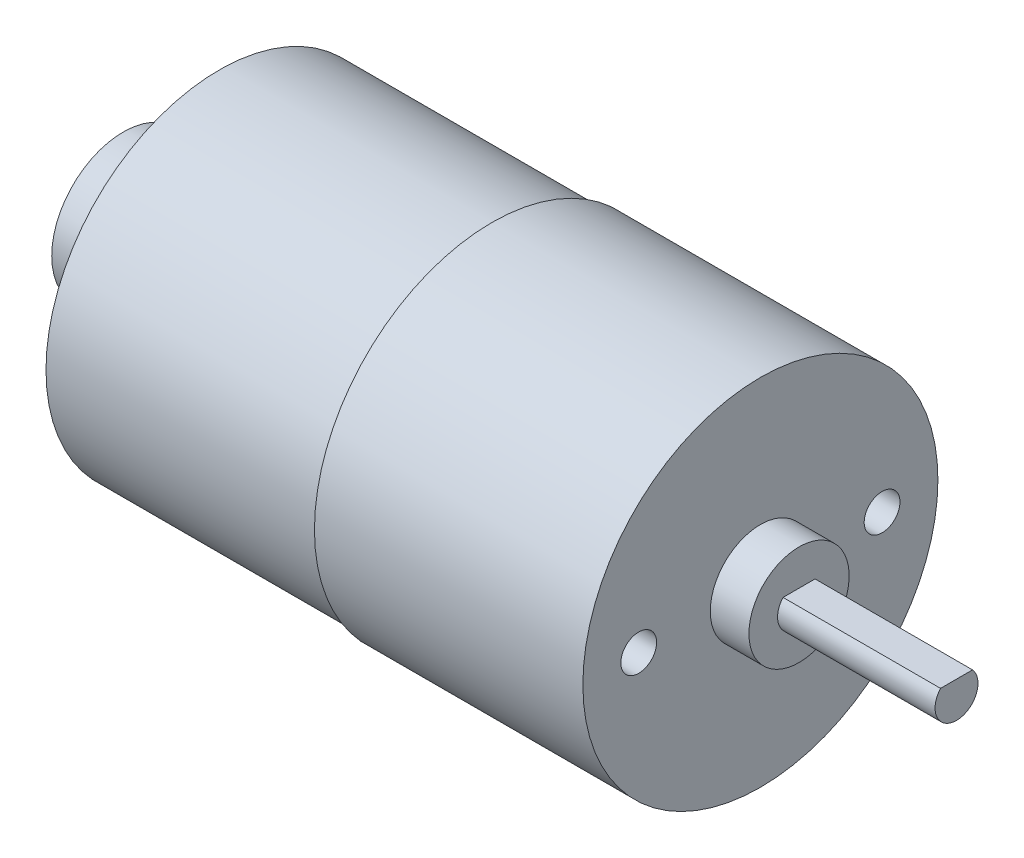
ISO-10303-21;
HEADER;
FILE_DESCRIPTION(('STEP AP214'),'2;1');
FILE_NAME('part.step','',(''),(''),'','','');
FILE_SCHEMA(('AUTOMOTIVE_DESIGN { 1 0 10303 214 1 1 1 1 }'));
ENDSEC;
DATA;
#1=APPLICATION_CONTEXT('core data for automotive mechanical design processes');
#2=APPLICATION_PROTOCOL_DEFINITION('international standard','automotive_design',2000,#1);
#3=PRODUCT_CONTEXT('',#1,'mechanical');
#4=PRODUCT('Part','Part','',(#3));
#5=PRODUCT_RELATED_PRODUCT_CATEGORY('part','',(#4));
#6=PRODUCT_DEFINITION_FORMATION('','',#4);
#7=PRODUCT_DEFINITION_CONTEXT('part definition',#1,'design');
#8=PRODUCT_DEFINITION('design','',#6,#7);
#9=PRODUCT_DEFINITION_SHAPE('','',#8);
#10=(LENGTH_UNIT() NAMED_UNIT(*) SI_UNIT(.MILLI.,.METRE.));
#11=(NAMED_UNIT(*) PLANE_ANGLE_UNIT() SI_UNIT($,.RADIAN.));
#12=(NAMED_UNIT(*) SI_UNIT($,.STERADIAN.) SOLID_ANGLE_UNIT());
#13=UNCERTAINTY_MEASURE_WITH_UNIT(LENGTH_MEASURE(1.E-05),#10,'distance_accuracy_value','');
#14=(GEOMETRIC_REPRESENTATION_CONTEXT(3) GLOBAL_UNCERTAINTY_ASSIGNED_CONTEXT((#13)) GLOBAL_UNIT_ASSIGNED_CONTEXT((#10,
#11,#12)) REPRESENTATION_CONTEXT('',''));
#15=CARTESIAN_POINT('',(0.,0.,0.));
#16=DIRECTION('',(0.,0.,1.));
#17=DIRECTION('',(1.,0.,0.));
#18=AXIS2_PLACEMENT_3D('',#15,#16,#17);
#19=CARTESIAN_POINT('',(37.8,12.4,0.));
#20=DIRECTION('',(-1.,0.,0.));
#21=DIRECTION('',(0.,0.,1.));
#22=AXIS2_PLACEMENT_3D('',#19,#20,#21);
#23=PLANE('',#22);
#24=CARTESIAN_POINT('',(37.8,0.,-8.5));
#25=DIRECTION('',(1.,0.,0.));
#26=DIRECTION('',(0.,0.,-1.));
#27=AXIS2_PLACEMENT_3D('',#24,#25,#26);
#28=CIRCLE('',#27,1.24999999999999);
#29=CARTESIAN_POINT('',(37.8,0.,-9.74999999999999));
#30=VERTEX_POINT('',#29);
#31=EDGE_CURVE('E82',#30,#30,#28,.T.);
#32=ORIENTED_EDGE('',*,*,#31,.F.);
#33=EDGE_LOOP('',(#32));
#34=FACE_BOUND('',#33,.T.);
#35=CARTESIAN_POINT('',(37.8,0.,0.));
#36=DIRECTION('',(-1.,0.,0.));
#37=DIRECTION('',(0.,0.,1.));
#38=AXIS2_PLACEMENT_3D('',#35,#36,#37);
#39=CIRCLE('',#38,12.4);
#40=CARTESIAN_POINT('',(37.8,0.,12.4));
#41=VERTEX_POINT('',#40);
#42=EDGE_CURVE('E98',#41,#41,#39,.T.);
#43=ORIENTED_EDGE('',*,*,#42,.F.);
#44=EDGE_LOOP('',(#43));
#45=FACE_BOUND('',#44,.T.);
#46=CARTESIAN_POINT('',(37.8,0.,0.));
#47=DIRECTION('',(-1.,0.,0.));
#48=DIRECTION('',(0.,0.,1.));
#49=AXIS2_PLACEMENT_3D('',#46,#47,#48);
#50=CIRCLE('',#49,3.5);
#51=CARTESIAN_POINT('',(37.8,0.,3.5));
#52=VERTEX_POINT('',#51);
#53=EDGE_CURVE('E95',#52,#52,#50,.T.);
#54=ORIENTED_EDGE('',*,*,#53,.T.);
#55=EDGE_LOOP('',(#54));
#56=FACE_BOUND('',#55,.T.);
#57=CARTESIAN_POINT('',(37.8,0.,8.5));
#58=DIRECTION('',(1.,0.,0.));
#59=DIRECTION('',(0.,0.,-1.));
#60=AXIS2_PLACEMENT_3D('',#57,#58,#59);
#61=CIRCLE('',#60,1.24999999999999);
#62=CARTESIAN_POINT('',(37.8,0.,7.25000000000001));
#63=VERTEX_POINT('',#62);
#64=EDGE_CURVE('E150',#63,#63,#61,.T.);
#65=ORIENTED_EDGE('',*,*,#64,.F.);
#66=EDGE_LOOP('',(#65));
#67=FACE_BOUND('',#66,.T.);
#68=ADVANCED_FACE('F43',(#34,#45,#56,#67),#23,.F.);
#69=CARTESIAN_POINT('',(0.,0.,0.));
#70=DIRECTION('',(1.,0.,0.));
#71=DIRECTION('',(0.,0.,-1.));
#72=AXIS2_PLACEMENT_3D('',#69,#70,#71);
#73=PLANE('',#72);
#74=CARTESIAN_POINT('',(0.,0.,0.));
#75=DIRECTION('',(-1.,0.,0.));
#76=DIRECTION('',(0.,0.,1.));
#77=AXIS2_PLACEMENT_3D('',#74,#75,#76);
#78=CIRCLE('',#77,5.);
#79=CARTESIAN_POINT('',(0.,0.,5.));
#80=VERTEX_POINT('',#79);
#81=EDGE_CURVE('E11',#80,#80,#78,.T.);
#82=ORIENTED_EDGE('',*,*,#81,.F.);
#83=EDGE_LOOP('',(#82));
#84=FACE_BOUND('',#83,.T.);
#85=CARTESIAN_POINT('',(0.,0.,0.));
#86=DIRECTION('',(-1.,0.,0.));
#87=DIRECTION('',(0.,0.,1.));
#88=AXIS2_PLACEMENT_3D('',#85,#86,#87);
#89=CIRCLE('',#88,12.1);
#90=CARTESIAN_POINT('',(0.,0.,12.1));
#91=VERTEX_POINT('',#90);
#92=EDGE_CURVE('E47',#91,#91,#89,.T.);
#93=ORIENTED_EDGE('',*,*,#92,.T.);
#94=EDGE_LOOP('',(#93));
#95=FACE_BOUND('',#94,.T.);
#96=ADVANCED_FACE('F45',(#84,#95),#73,.F.);
#97=CARTESIAN_POINT('',(0.,0.,0.));
#98=DIRECTION('',(-1.,0.,0.));
#99=DIRECTION('',(0.,0.,1.));
#100=AXIS2_PLACEMENT_3D('',#97,#98,#99);
#101=CYLINDRICAL_SURFACE('',#100,12.1);
#102=ORIENTED_EDGE('',*,*,#92,.F.);
#103=EDGE_LOOP('',(#102));
#104=FACE_BOUND('',#103,.T.);
#105=CARTESIAN_POINT('',(19.05,0.,0.));
#106=DIRECTION('',(-1.,0.,0.));
#107=DIRECTION('',(0.,0.,1.));
#108=AXIS2_PLACEMENT_3D('',#105,#106,#107);
#109=CIRCLE('',#108,12.1);
#110=CARTESIAN_POINT('',(19.05,0.,12.1));
#111=VERTEX_POINT('',#110);
#112=EDGE_CURVE('E103',#111,#111,#109,.T.);
#113=ORIENTED_EDGE('',*,*,#112,.T.);
#114=EDGE_LOOP('',(#113));
#115=FACE_BOUND('',#114,.T.);
#116=ADVANCED_FACE('F111',(#104,#115),#101,.T.);
#117=CARTESIAN_POINT('',(19.05,12.1,0.));
#118=DIRECTION('',(1.,0.,0.));
#119=DIRECTION('',(0.,0.,-1.));
#120=AXIS2_PLACEMENT_3D('',#117,#118,#119);
#121=PLANE('',#120);
#122=ORIENTED_EDGE('',*,*,#112,.F.);
#123=EDGE_LOOP('',(#122));
#124=FACE_BOUND('',#123,.T.);
#125=CARTESIAN_POINT('',(19.05,0.,0.));
#126=DIRECTION('',(-1.,0.,0.));
#127=DIRECTION('',(0.,0.,1.));
#128=AXIS2_PLACEMENT_3D('',#125,#126,#127);
#129=CIRCLE('',#128,12.4);
#130=CARTESIAN_POINT('',(19.05,0.,12.4));
#131=VERTEX_POINT('',#130);
#132=EDGE_CURVE('E101',#131,#131,#129,.T.);
#133=ORIENTED_EDGE('',*,*,#132,.T.);
#134=EDGE_LOOP('',(#133));
#135=FACE_BOUND('',#134,.T.);
#136=ADVANCED_FACE('F113',(#124,#135),#121,.F.);
#137=CARTESIAN_POINT('',(0.,0.,0.));
#138=DIRECTION('',(-1.,0.,0.));
#139=DIRECTION('',(0.,0.,1.));
#140=AXIS2_PLACEMENT_3D('',#137,#138,#139);
#141=CYLINDRICAL_SURFACE('',#140,12.4);
#142=ORIENTED_EDGE('',*,*,#132,.F.);
#143=EDGE_LOOP('',(#142));
#144=FACE_BOUND('',#143,.T.);
#145=ORIENTED_EDGE('',*,*,#42,.T.);
#146=EDGE_LOOP('',(#145));
#147=FACE_BOUND('',#146,.T.);
#148=ADVANCED_FACE('F117',(#144,#147),#141,.T.);
#149=CARTESIAN_POINT('',(0.,0.,0.));
#150=DIRECTION('',(-1.,0.,0.));
#151=DIRECTION('',(0.,0.,1.));
#152=AXIS2_PLACEMENT_3D('',#149,#150,#151);
#153=CYLINDRICAL_SURFACE('',#152,3.5);
#154=ORIENTED_EDGE('',*,*,#53,.F.);
#155=EDGE_LOOP('',(#154));
#156=FACE_BOUND('',#155,.T.);
#157=CARTESIAN_POINT('',(40.5,0.,0.));
#158=DIRECTION('',(-1.,0.,0.));
#159=DIRECTION('',(0.,0.,1.));
#160=AXIS2_PLACEMENT_3D('',#157,#158,#159);
#161=CIRCLE('',#160,3.5);
#162=CARTESIAN_POINT('',(40.5,0.,3.5));
#163=VERTEX_POINT('',#162);
#164=EDGE_CURVE('E87',#163,#163,#161,.T.);
#165=ORIENTED_EDGE('',*,*,#164,.T.);
#166=EDGE_LOOP('',(#165));
#167=FACE_BOUND('',#166,.T.);
#168=ADVANCED_FACE('F133',(#156,#167),#153,.T.);
#169=CARTESIAN_POINT('',(40.5,3.5,0.));
#170=DIRECTION('',(-1.,0.,0.));
#171=DIRECTION('',(0.,0.,1.));
#172=AXIS2_PLACEMENT_3D('',#169,#170,#171);
#173=PLANE('',#172);
#174=ORIENTED_EDGE('',*,*,#164,.F.);
#175=EDGE_LOOP('',(#174));
#176=FACE_BOUND('',#175,.T.);
#177=CARTESIAN_POINT('',(40.5,0.,0.));
#178=DIRECTION('',(-1.,0.,0.));
#179=DIRECTION('',(0.,0.,1.));
#180=AXIS2_PLACEMENT_3D('',#177,#178,#179);
#181=CIRCLE('',#180,1.5);
#182=CARTESIAN_POINT('',(40.5,1.,-1.1180339887499));
#183=VERTEX_POINT('',#182);
#184=CARTESIAN_POINT('',(40.5,1.,1.1180339887499));
#185=VERTEX_POINT('',#184);
#186=EDGE_CURVE('E81',#183,#185,#181,.T.);
#187=ORIENTED_EDGE('',*,*,#186,.T.);
#188=DIRECTION('',(0.,0.,-1.));
#189=VECTOR('',#188,1.);
#190=CARTESIAN_POINT('',(40.5,1.,1.1180339887499));
#191=LINE('',#190,#189);
#192=EDGE_CURVE('E74',#185,#183,#191,.T.);
#193=ORIENTED_EDGE('',*,*,#192,.T.);
#194=EDGE_LOOP('',(#187,#193));
#195=FACE_BOUND('',#194,.T.);
#196=ADVANCED_FACE('F140',(#176,#195),#173,.F.);
#197=CARTESIAN_POINT('',(0.,0.,0.));
#198=DIRECTION('',(-1.,0.,0.));
#199=DIRECTION('',(0.,0.,1.));
#200=AXIS2_PLACEMENT_3D('',#197,#198,#199);
#201=CYLINDRICAL_SURFACE('',#200,1.5);
#202=CARTESIAN_POINT('',(51.5,0.,0.));
#203=DIRECTION('',(-1.,0.,0.));
#204=DIRECTION('',(0.,0.,1.));
#205=AXIS2_PLACEMENT_3D('',#202,#203,#204);
#206=CIRCLE('',#205,1.5);
#207=CARTESIAN_POINT('',(51.5,1.,-1.1180339887499));
#208=VERTEX_POINT('',#207);
#209=CARTESIAN_POINT('',(51.5,1.,1.11803398874989));
#210=VERTEX_POINT('',#209);
#211=EDGE_CURVE('E79',#208,#210,#206,.T.);
#212=ORIENTED_EDGE('',*,*,#211,.T.);
#213=DIRECTION('',(1.,0.,0.));
#214=VECTOR('',#213,1.);
#215=CARTESIAN_POINT('',(40.5,1.,1.1180339887499));
#216=LINE('',#215,#214);
#217=EDGE_CURVE('E59',#185,#210,#216,.T.);
#218=ORIENTED_EDGE('',*,*,#217,.F.);
#219=ORIENTED_EDGE('',*,*,#186,.F.);
#220=DIRECTION('',(1.,0.,0.));
#221=VECTOR('',#220,1.);
#222=CARTESIAN_POINT('',(40.5,1.,-1.1180339887499));
#223=LINE('',#222,#221);
#224=EDGE_CURVE('E65',#183,#208,#223,.T.);
#225=ORIENTED_EDGE('',*,*,#224,.T.);
#226=EDGE_LOOP('',(#212,#218,#219,#225));
#227=FACE_BOUND('',#226,.T.);
#228=ADVANCED_FACE('F78',(#227),#201,.T.);
#229=CARTESIAN_POINT('',(51.5,1.5,0.));
#230=DIRECTION('',(-1.,0.,0.));
#231=DIRECTION('',(0.,0.,1.));
#232=AXIS2_PLACEMENT_3D('',#229,#230,#231);
#233=PLANE('',#232);
#234=ORIENTED_EDGE('',*,*,#211,.F.);
#235=DIRECTION('',(0.,0.,-1.));
#236=VECTOR('',#235,1.);
#237=CARTESIAN_POINT('',(51.5,1.,1.1180339887499));
#238=LINE('',#237,#236);
#239=EDGE_CURVE('E69',#210,#208,#238,.T.);
#240=ORIENTED_EDGE('',*,*,#239,.F.);
#241=EDGE_LOOP('',(#234,#240));
#242=FACE_BOUND('',#241,.T.);
#243=ADVANCED_FACE('F84',(#242),#233,.F.);
#244=CARTESIAN_POINT('',(-6.7,0.,0.));
#245=DIRECTION('',(1.,0.,0.));
#246=DIRECTION('',(0.,0.,-1.));
#247=AXIS2_PLACEMENT_3D('',#244,#245,#246);
#248=CYLINDRICAL_SURFACE('',#247,5.);
#249=CARTESIAN_POINT('',(-6.7,0.,0.));
#250=DIRECTION('',(-1.,0.,0.));
#251=DIRECTION('',(0.,0.,1.));
#252=AXIS2_PLACEMENT_3D('',#249,#250,#251);
#253=CIRCLE('',#252,5.);
#254=CARTESIAN_POINT('',(-6.7,0.,5.));
#255=VERTEX_POINT('',#254);
#256=EDGE_CURVE('E85',#255,#255,#253,.T.);
#257=ORIENTED_EDGE('',*,*,#256,.F.);
#258=EDGE_LOOP('',(#257));
#259=FACE_BOUND('',#258,.T.);
#260=ORIENTED_EDGE('',*,*,#81,.T.);
#261=EDGE_LOOP('',(#260));
#262=FACE_BOUND('',#261,.T.);
#263=ADVANCED_FACE('F174',(#259,#262),#248,.T.);
#264=CARTESIAN_POINT('',(-6.7,0.,0.));
#265=DIRECTION('',(-1.,0.,0.));
#266=DIRECTION('',(0.,0.,1.));
#267=AXIS2_PLACEMENT_3D('',#264,#265,#266);
#268=PLANE('',#267);
#269=ORIENTED_EDGE('',*,*,#256,.T.);
#270=EDGE_LOOP('',(#269));
#271=FACE_BOUND('',#270,.T.);
#272=ADVANCED_FACE('F177',(#271),#268,.T.);
#273=CARTESIAN_POINT('',(32.8,0.,8.5));
#274=DIRECTION('',(-1.,0.,0.));
#275=DIRECTION('',(0.,0.,1.));
#276=AXIS2_PLACEMENT_3D('',#273,#274,#275);
#277=PLANE('',#276);
#278=CARTESIAN_POINT('',(32.8,0.,8.5));
#279=DIRECTION('',(1.,0.,0.));
#280=DIRECTION('',(0.,0.,-1.));
#281=AXIS2_PLACEMENT_3D('',#278,#279,#280);
#282=CIRCLE('',#281,1.25);
#283=CARTESIAN_POINT('',(32.8,0.,7.25));
#284=VERTEX_POINT('',#283);
#285=EDGE_CURVE('E90',#284,#284,#282,.T.);
#286=ORIENTED_EDGE('',*,*,#285,.T.);
#287=EDGE_LOOP('',(#286));
#288=FACE_BOUND('',#287,.T.);
#289=ADVANCED_FACE('F181',(#288),#277,.F.);
#290=CARTESIAN_POINT('',(37.8,0.,8.5));
#291=DIRECTION('',(1.,0.,0.));
#292=DIRECTION('',(0.,0.,-1.));
#293=AXIS2_PLACEMENT_3D('',#290,#291,#292);
#294=CYLINDRICAL_SURFACE('',#293,1.24999999999999);
#295=ORIENTED_EDGE('',*,*,#285,.F.);
#296=EDGE_LOOP('',(#295));
#297=FACE_BOUND('',#296,.T.);
#298=ORIENTED_EDGE('',*,*,#64,.T.);
#299=EDGE_LOOP('',(#298));
#300=FACE_BOUND('',#299,.T.);
#301=ADVANCED_FACE('F185',(#297,#300),#294,.F.);
#302=CARTESIAN_POINT('',(32.8,0.,-8.5));
#303=DIRECTION('',(-1.,0.,0.));
#304=DIRECTION('',(0.,0.,1.));
#305=AXIS2_PLACEMENT_3D('',#302,#303,#304);
#306=PLANE('',#305);
#307=CARTESIAN_POINT('',(32.8,0.,-8.5));
#308=DIRECTION('',(1.,0.,0.));
#309=DIRECTION('',(0.,0.,-1.));
#310=AXIS2_PLACEMENT_3D('',#307,#308,#309);
#311=CIRCLE('',#310,1.25);
#312=CARTESIAN_POINT('',(32.8,0.,-9.74999999999999));
#313=VERTEX_POINT('',#312);
#314=EDGE_CURVE('E152',#313,#313,#311,.T.);
#315=ORIENTED_EDGE('',*,*,#314,.T.);
#316=EDGE_LOOP('',(#315));
#317=FACE_BOUND('',#316,.T.);
#318=ADVANCED_FACE('F189',(#317),#306,.F.);
#319=CARTESIAN_POINT('',(37.8,0.,-8.5));
#320=DIRECTION('',(1.,0.,0.));
#321=DIRECTION('',(0.,0.,-1.));
#322=AXIS2_PLACEMENT_3D('',#319,#320,#321);
#323=CYLINDRICAL_SURFACE('',#322,1.24999999999999);
#324=ORIENTED_EDGE('',*,*,#314,.F.);
#325=EDGE_LOOP('',(#324));
#326=FACE_BOUND('',#325,.T.);
#327=ORIENTED_EDGE('',*,*,#31,.T.);
#328=EDGE_LOOP('',(#327));
#329=FACE_BOUND('',#328,.T.);
#330=ADVANCED_FACE('F192',(#326,#329),#323,.F.);
#331=CARTESIAN_POINT('',(40.5,1.,1.1180339887499));
#332=DIRECTION('',(0.,-1.,0.));
#333=DIRECTION('',(0.,0.,-1.));
#334=AXIS2_PLACEMENT_3D('',#331,#332,#333);
#335=PLANE('',#334);
#336=ORIENTED_EDGE('',*,*,#239,.T.);
#337=ORIENTED_EDGE('',*,*,#224,.F.);
#338=ORIENTED_EDGE('',*,*,#192,.F.);
#339=ORIENTED_EDGE('',*,*,#217,.T.);
#340=EDGE_LOOP('',(#336,#337,#338,#339));
#341=FACE_BOUND('',#340,.T.);
#342=ADVANCED_FACE('F70',(#341),#335,.F.);
#343=CLOSED_SHELL('',(#68,#96,#116,#136,#148,#168,#196,#228,#243,#263,#272,#289,#301,#318,#330,#342));
#344=MANIFOLD_SOLID_BREP('B2',#343);
#345=ADVANCED_BREP_SHAPE_REPRESENTATION('',(#18,#344),#14);
#346=SHAPE_DEFINITION_REPRESENTATION(#9,#345);
ENDSEC;
END-ISO-10303-21;
